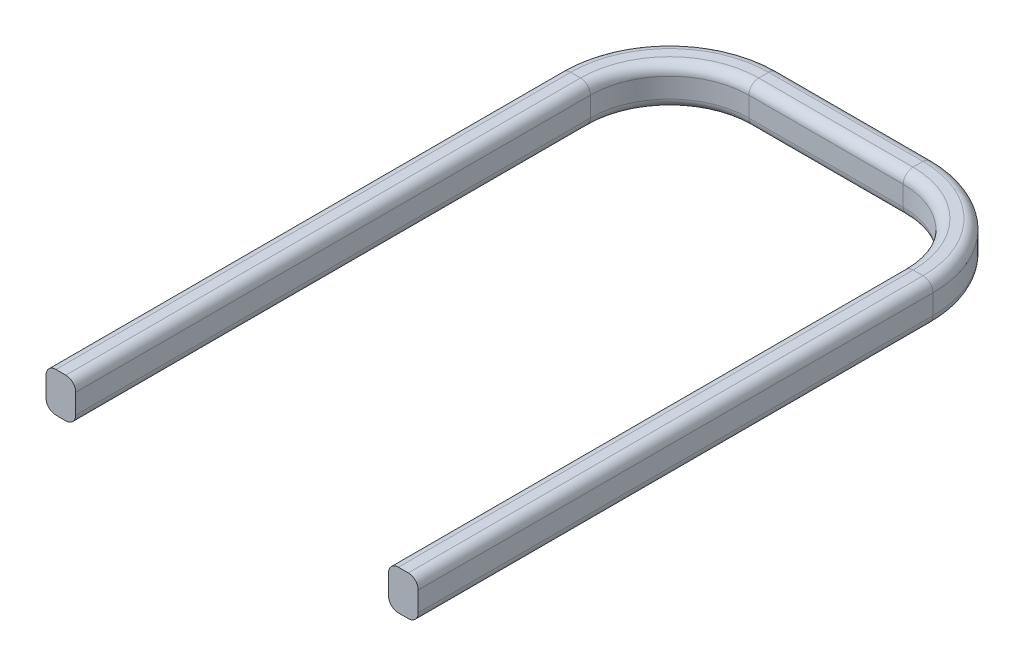
ISO-10303-21;
HEADER;
FILE_DESCRIPTION(('STEP AP214'),'2;1');
FILE_NAME('part.step','',(''),(''),'','','');
FILE_SCHEMA(('AUTOMOTIVE_DESIGN { 1 0 10303 214 1 1 1 1 }'));
ENDSEC;
DATA;
#1=APPLICATION_CONTEXT('core data for automotive mechanical design processes');
#2=APPLICATION_PROTOCOL_DEFINITION('international standard','automotive_design',2000,#1);
#3=PRODUCT_CONTEXT('',#1,'mechanical');
#4=PRODUCT('Part','Part','',(#3));
#5=PRODUCT_RELATED_PRODUCT_CATEGORY('part','',(#4));
#6=PRODUCT_DEFINITION_FORMATION('','',#4);
#7=PRODUCT_DEFINITION_CONTEXT('part definition',#1,'design');
#8=PRODUCT_DEFINITION('design','',#6,#7);
#9=PRODUCT_DEFINITION_SHAPE('','',#8);
#10=(LENGTH_UNIT() NAMED_UNIT(*) SI_UNIT(.MILLI.,.METRE.));
#11=(NAMED_UNIT(*) PLANE_ANGLE_UNIT() SI_UNIT($,.RADIAN.));
#12=(NAMED_UNIT(*) SI_UNIT($,.STERADIAN.) SOLID_ANGLE_UNIT());
#13=UNCERTAINTY_MEASURE_WITH_UNIT(LENGTH_MEASURE(1.E-05),#10,'distance_accuracy_value','');
#14=(GEOMETRIC_REPRESENTATION_CONTEXT(3) GLOBAL_UNCERTAINTY_ASSIGNED_CONTEXT((#13)) GLOBAL_UNIT_ASSIGNED_CONTEXT((#10,
#11,#12)) REPRESENTATION_CONTEXT('',''));
#15=CARTESIAN_POINT('',(0.,0.,0.));
#16=DIRECTION('',(0.,0.,1.));
#17=DIRECTION('',(1.,0.,0.));
#18=AXIS2_PLACEMENT_3D('',#15,#16,#17);
#19=CARTESIAN_POINT('',(0.,0.,0.));
#20=DIRECTION('',(0.,0.,1.));
#21=DIRECTION('',(1.,0.,0.));
#22=AXIS2_PLACEMENT_3D('',#19,#20,#21);
#23=PLANE('',#22);
#24=DIRECTION('',(0.,-1.,0.));
#25=VECTOR('',#24,1.);
#26=CARTESIAN_POINT('',(-4.7,0.,0.));
#27=LINE('',#26,#25);
#28=CARTESIAN_POINT('',(-4.7,0.75,0.));
#29=VERTEX_POINT('',#28);
#30=CARTESIAN_POINT('',(-4.7,0.25,0.));
#31=VERTEX_POINT('',#30);
#32=EDGE_CURVE('E386',#29,#31,#27,.T.);
#33=ORIENTED_EDGE('',*,*,#32,.T.);
#34=CARTESIAN_POINT('',(-4.45,0.25,0.));
#35=DIRECTION('',(0.,0.,1.));
#36=DIRECTION('',(1.,0.,0.));
#37=AXIS2_PLACEMENT_3D('',#34,#35,#36);
#38=CIRCLE('',#37,0.25);
#39=CARTESIAN_POINT('',(-4.45,0.,0.));
#40=VERTEX_POINT('',#39);
#41=EDGE_CURVE('E311',#31,#40,#38,.T.);
#42=ORIENTED_EDGE('',*,*,#41,.T.);
#43=DIRECTION('',(1.,0.,0.));
#44=VECTOR('',#43,1.);
#45=CARTESIAN_POINT('',(-3.95,0.,0.));
#46=LINE('',#45,#44);
#47=CARTESIAN_POINT('',(-4.2,0.,0.));
#48=VERTEX_POINT('',#47);
#49=EDGE_CURVE('E391',#40,#48,#46,.T.);
#50=ORIENTED_EDGE('',*,*,#49,.T.);
#51=CARTESIAN_POINT('',(-4.2,0.25,0.));
#52=DIRECTION('',(0.,0.,1.));
#53=DIRECTION('',(1.,0.,0.));
#54=AXIS2_PLACEMENT_3D('',#51,#52,#53);
#55=CIRCLE('',#54,0.25);
#56=CARTESIAN_POINT('',(-3.95,0.25,0.));
#57=VERTEX_POINT('',#56);
#58=EDGE_CURVE('E309',#48,#57,#55,.T.);
#59=ORIENTED_EDGE('',*,*,#58,.T.);
#60=DIRECTION('',(0.,1.,0.));
#61=VECTOR('',#60,1.);
#62=CARTESIAN_POINT('',(-3.95,0.,0.));
#63=LINE('',#62,#61);
#64=CARTESIAN_POINT('',(-3.95,0.75,0.));
#65=VERTEX_POINT('',#64);
#66=EDGE_CURVE('E330',#57,#65,#63,.T.);
#67=ORIENTED_EDGE('',*,*,#66,.T.);
#68=CARTESIAN_POINT('',(-4.2,0.75,0.));
#69=DIRECTION('',(0.,0.,1.));
#70=DIRECTION('',(1.,0.,0.));
#71=AXIS2_PLACEMENT_3D('',#68,#69,#70);
#72=CIRCLE('',#71,0.25);
#73=CARTESIAN_POINT('',(-4.2,1.,0.));
#74=VERTEX_POINT('',#73);
#75=EDGE_CURVE('E57',#65,#74,#72,.T.);
#76=ORIENTED_EDGE('',*,*,#75,.T.);
#77=DIRECTION('',(-1.,0.,0.));
#78=VECTOR('',#77,1.);
#79=CARTESIAN_POINT('',(-3.95,1.,0.));
#80=LINE('',#79,#78);
#81=CARTESIAN_POINT('',(-4.45,1.,0.));
#82=VERTEX_POINT('',#81);
#83=EDGE_CURVE('E384',#74,#82,#80,.T.);
#84=ORIENTED_EDGE('',*,*,#83,.T.);
#85=CARTESIAN_POINT('',(-4.45,0.75,0.));
#86=DIRECTION('',(0.,0.,1.));
#87=DIRECTION('',(1.,0.,0.));
#88=AXIS2_PLACEMENT_3D('',#85,#86,#87);
#89=CIRCLE('',#88,0.25);
#90=EDGE_CURVE('E307',#82,#29,#89,.T.);
#91=ORIENTED_EDGE('',*,*,#90,.T.);
#92=EDGE_LOOP('',(#33,#42,#50,#59,#67,#76,#84,#91));
#93=FACE_BOUND('',#92,.T.);
#94=ADVANCED_FACE('F35',(#93),#23,.T.);
#95=CARTESIAN_POINT('',(0.,0.,0.));
#96=DIRECTION('',(0.,0.,-1.));
#97=DIRECTION('',(-1.,0.,0.));
#98=AXIS2_PLACEMENT_3D('',#95,#96,#97);
#99=PLANE('',#98);
#100=DIRECTION('',(-1.,0.,0.));
#101=VECTOR('',#100,1.);
#102=CARTESIAN_POINT('',(3.95,0.,0.));
#103=LINE('',#102,#101);
#104=CARTESIAN_POINT('',(4.45,0.,0.));
#105=VERTEX_POINT('',#104);
#106=CARTESIAN_POINT('',(4.2,0.,0.));
#107=VERTEX_POINT('',#106);
#108=EDGE_CURVE('E215',#105,#107,#103,.T.);
#109=ORIENTED_EDGE('',*,*,#108,.F.);
#110=CARTESIAN_POINT('',(4.45,0.25,0.));
#111=DIRECTION('',(0.,0.,-1.));
#112=DIRECTION('',(-1.,0.,0.));
#113=AXIS2_PLACEMENT_3D('',#110,#111,#112);
#114=CIRCLE('',#113,0.25);
#115=CARTESIAN_POINT('',(4.7,0.25,0.));
#116=VERTEX_POINT('',#115);
#117=EDGE_CURVE('E198',#105,#116,#114,.F.);
#118=ORIENTED_EDGE('',*,*,#117,.T.);
#119=DIRECTION('',(0.,-1.,0.));
#120=VECTOR('',#119,1.);
#121=CARTESIAN_POINT('',(4.7,0.,0.));
#122=LINE('',#121,#120);
#123=CARTESIAN_POINT('',(4.7,0.75,0.));
#124=VERTEX_POINT('',#123);
#125=EDGE_CURVE('E225',#124,#116,#122,.T.);
#126=ORIENTED_EDGE('',*,*,#125,.F.);
#127=CARTESIAN_POINT('',(4.45,0.75,0.));
#128=DIRECTION('',(0.,0.,-1.));
#129=DIRECTION('',(-1.,0.,0.));
#130=AXIS2_PLACEMENT_3D('',#127,#128,#129);
#131=CIRCLE('',#130,0.25);
#132=CARTESIAN_POINT('',(4.45,1.,0.));
#133=VERTEX_POINT('',#132);
#134=EDGE_CURVE('E234',#124,#133,#131,.F.);
#135=ORIENTED_EDGE('',*,*,#134,.T.);
#136=DIRECTION('',(1.,0.,0.));
#137=VECTOR('',#136,1.);
#138=CARTESIAN_POINT('',(3.95,1.,0.));
#139=LINE('',#138,#137);
#140=CARTESIAN_POINT('',(4.2,1.,0.));
#141=VERTEX_POINT('',#140);
#142=EDGE_CURVE('E228',#141,#133,#139,.T.);
#143=ORIENTED_EDGE('',*,*,#142,.F.);
#144=CARTESIAN_POINT('',(4.2,0.75,0.));
#145=DIRECTION('',(0.,0.,-1.));
#146=DIRECTION('',(-1.,0.,0.));
#147=AXIS2_PLACEMENT_3D('',#144,#145,#146);
#148=CIRCLE('',#147,0.25);
#149=CARTESIAN_POINT('',(3.95,0.75,0.));
#150=VERTEX_POINT('',#149);
#151=EDGE_CURVE('E220',#141,#150,#148,.F.);
#152=ORIENTED_EDGE('',*,*,#151,.T.);
#153=DIRECTION('',(0.,1.,0.));
#154=VECTOR('',#153,1.);
#155=CARTESIAN_POINT('',(3.95,0.,0.));
#156=LINE('',#155,#154);
#157=CARTESIAN_POINT('',(3.95,0.25,0.));
#158=VERTEX_POINT('',#157);
#159=EDGE_CURVE('E407',#158,#150,#156,.T.);
#160=ORIENTED_EDGE('',*,*,#159,.F.);
#161=CARTESIAN_POINT('',(4.2,0.25,0.));
#162=DIRECTION('',(0.,0.,-1.));
#163=DIRECTION('',(-1.,0.,0.));
#164=AXIS2_PLACEMENT_3D('',#161,#162,#163);
#165=CIRCLE('',#164,0.25);
#166=EDGE_CURVE('E209',#158,#107,#165,.F.);
#167=ORIENTED_EDGE('',*,*,#166,.T.);
#168=EDGE_LOOP('',(#109,#118,#126,#135,#143,#152,#160,#167));
#169=FACE_BOUND('',#168,.T.);
#170=ADVANCED_FACE('F223',(#169),#99,.F.);
#171=CARTESIAN_POINT('',(-3.95,0.,0.));
#172=DIRECTION('',(-1.,0.,0.));
#173=DIRECTION('',(0.,0.,1.));
#174=AXIS2_PLACEMENT_3D('',#171,#172,#173);
#175=PLANE('',#174);
#176=ORIENTED_EDGE('',*,*,#66,.F.);
#177=DIRECTION('',(0.,0.,-1.));
#178=VECTOR('',#177,1.);
#179=CARTESIAN_POINT('',(-3.95,0.25,0.));
#180=LINE('',#179,#178);
#181=CARTESIAN_POINT('',(-3.95,0.25,-13.));
#182=VERTEX_POINT('',#181);
#183=EDGE_CURVE('E315',#57,#182,#180,.T.);
#184=ORIENTED_EDGE('',*,*,#183,.T.);
#185=DIRECTION('',(0.,1.,0.));
#186=VECTOR('',#185,1.);
#187=CARTESIAN_POINT('',(-3.95,0.,-13.));
#188=LINE('',#187,#186);
#189=CARTESIAN_POINT('',(-3.95,0.75,-13.));
#190=VERTEX_POINT('',#189);
#191=EDGE_CURVE('E380',#182,#190,#188,.T.);
#192=ORIENTED_EDGE('',*,*,#191,.T.);
#193=DIRECTION('',(0.,0.,-1.));
#194=VECTOR('',#193,1.);
#195=CARTESIAN_POINT('',(-3.95,0.75,0.));
#196=LINE('',#195,#194);
#197=EDGE_CURVE('E313',#190,#65,#196,.F.);
#198=ORIENTED_EDGE('',*,*,#197,.T.);
#199=EDGE_LOOP('',(#176,#184,#192,#198));
#200=FACE_BOUND('',#199,.T.);
#201=ADVANCED_FACE('F377',(#200),#175,.F.);
#202=CARTESIAN_POINT('',(-3.95,1.,0.));
#203=DIRECTION('',(0.,-1.,0.));
#204=DIRECTION('',(1.,0.,0.));
#205=AXIS2_PLACEMENT_3D('',#202,#203,#204);
#206=PLANE('',#205);
#207=DIRECTION('',(-1.,0.,0.));
#208=VECTOR('',#207,1.);
#209=CARTESIAN_POINT('',(-3.95,1.,-13.));
#210=LINE('',#209,#208);
#211=CARTESIAN_POINT('',(-4.2,1.,-13.));
#212=VERTEX_POINT('',#211);
#213=CARTESIAN_POINT('',(-4.45,1.,-13.));
#214=VERTEX_POINT('',#213);
#215=EDGE_CURVE('E390',#212,#214,#210,.T.);
#216=ORIENTED_EDGE('',*,*,#215,.T.);
#217=DIRECTION('',(0.,0.,-1.));
#218=VECTOR('',#217,1.);
#219=CARTESIAN_POINT('',(-4.45,1.,0.));
#220=LINE('',#219,#218);
#221=EDGE_CURVE('E11',#214,#82,#220,.F.);
#222=ORIENTED_EDGE('',*,*,#221,.T.);
#223=ORIENTED_EDGE('',*,*,#83,.F.);
#224=DIRECTION('',(0.,0.,-1.));
#225=VECTOR('',#224,1.);
#226=CARTESIAN_POINT('',(-4.2,1.,0.));
#227=LINE('',#226,#225);
#228=EDGE_CURVE('E44',#74,#212,#227,.T.);
#229=ORIENTED_EDGE('',*,*,#228,.T.);
#230=EDGE_LOOP('',(#216,#222,#223,#229));
#231=FACE_BOUND('',#230,.T.);
#232=ADVANCED_FACE('F788',(#231),#206,.F.);
#233=CARTESIAN_POINT('',(-4.7,0.,0.));
#234=DIRECTION('',(1.,0.,0.));
#235=DIRECTION('',(0.,0.,-1.));
#236=AXIS2_PLACEMENT_3D('',#233,#234,#235);
#237=PLANE('',#236);
#238=DIRECTION('',(0.,-1.,0.));
#239=VECTOR('',#238,1.);
#240=CARTESIAN_POINT('',(-4.7,0.,-13.));
#241=LINE('',#240,#239);
#242=CARTESIAN_POINT('',(-4.7,0.75,-13.));
#243=VERTEX_POINT('',#242);
#244=CARTESIAN_POINT('',(-4.7,0.25,-13.));
#245=VERTEX_POINT('',#244);
#246=EDGE_CURVE('E411',#243,#245,#241,.T.);
#247=ORIENTED_EDGE('',*,*,#246,.T.);
#248=DIRECTION('',(0.,0.,-1.));
#249=VECTOR('',#248,1.);
#250=CARTESIAN_POINT('',(-4.7,0.25,0.));
#251=LINE('',#250,#249);
#252=EDGE_CURVE('E304',#245,#31,#251,.F.);
#253=ORIENTED_EDGE('',*,*,#252,.T.);
#254=ORIENTED_EDGE('',*,*,#32,.F.);
#255=DIRECTION('',(0.,0.,-1.));
#256=VECTOR('',#255,1.);
#257=CARTESIAN_POINT('',(-4.7,0.75,0.));
#258=LINE('',#257,#256);
#259=EDGE_CURVE('E302',#29,#243,#258,.T.);
#260=ORIENTED_EDGE('',*,*,#259,.T.);
#261=EDGE_LOOP('',(#247,#253,#254,#260));
#262=FACE_BOUND('',#261,.T.);
#263=ADVANCED_FACE('F778',(#262),#237,.F.);
#264=CARTESIAN_POINT('',(-3.95,0.,0.));
#265=DIRECTION('',(0.,1.,0.));
#266=DIRECTION('',(-1.,0.,0.));
#267=AXIS2_PLACEMENT_3D('',#264,#265,#266);
#268=PLANE('',#267);
#269=ORIENTED_EDGE('',*,*,#49,.F.);
#270=DIRECTION('',(0.,0.,-1.));
#271=VECTOR('',#270,1.);
#272=CARTESIAN_POINT('',(-4.45,0.,0.));
#273=LINE('',#272,#271);
#274=CARTESIAN_POINT('',(-4.45,0.,-13.));
#275=VERTEX_POINT('',#274);
#276=EDGE_CURVE('E300',#40,#275,#273,.T.);
#277=ORIENTED_EDGE('',*,*,#276,.T.);
#278=DIRECTION('',(1.,0.,0.));
#279=VECTOR('',#278,1.);
#280=CARTESIAN_POINT('',(-3.95,0.,-13.));
#281=LINE('',#280,#279);
#282=CARTESIAN_POINT('',(-4.2,0.,-13.));
#283=VERTEX_POINT('',#282);
#284=EDGE_CURVE('E396',#275,#283,#281,.T.);
#285=ORIENTED_EDGE('',*,*,#284,.T.);
#286=DIRECTION('',(0.,0.,-1.));
#287=VECTOR('',#286,1.);
#288=CARTESIAN_POINT('',(-4.2,0.,0.));
#289=LINE('',#288,#287);
#290=EDGE_CURVE('E298',#283,#48,#289,.F.);
#291=ORIENTED_EDGE('',*,*,#290,.T.);
#292=EDGE_LOOP('',(#269,#277,#285,#291));
#293=FACE_BOUND('',#292,.T.);
#294=ADVANCED_FACE('F768',(#293),#268,.F.);
#295=CARTESIAN_POINT('',(-1.95,0.,-13.));
#296=DIRECTION('',(0.,-1.,0.));
#297=DIRECTION('',(0.,0.,-1.));
#298=AXIS2_PLACEMENT_3D('',#295,#296,#297);
#299=CYLINDRICAL_SURFACE('',#298,2.);
#300=ORIENTED_EDGE('',*,*,#191,.F.);
#301=CARTESIAN_POINT('',(-1.95,0.25,-13.));
#302=DIRECTION('',(0.,1.,0.));
#303=DIRECTION('',(0.,0.,1.));
#304=AXIS2_PLACEMENT_3D('',#301,#302,#303);
#305=CIRCLE('',#304,2.);
#306=CARTESIAN_POINT('',(-1.95,0.25,-15.));
#307=VERTEX_POINT('',#306);
#308=EDGE_CURVE('E279',#182,#307,#305,.F.);
#309=ORIENTED_EDGE('',*,*,#308,.T.);
#310=DIRECTION('',(0.,1.,0.));
#311=VECTOR('',#310,1.);
#312=CARTESIAN_POINT('',(-1.95,0.,-15.));
#313=LINE('',#312,#311);
#314=CARTESIAN_POINT('',(-1.95,0.75,-15.));
#315=VERTEX_POINT('',#314);
#316=EDGE_CURVE('E392',#307,#315,#313,.T.);
#317=ORIENTED_EDGE('',*,*,#316,.T.);
#318=CARTESIAN_POINT('',(-1.95,0.75,-13.));
#319=DIRECTION('',(0.,-1.,0.));
#320=DIRECTION('',(0.,0.,-1.));
#321=AXIS2_PLACEMENT_3D('',#318,#319,#320);
#322=CIRCLE('',#321,2.);
#323=EDGE_CURVE('E277',#315,#190,#322,.F.);
#324=ORIENTED_EDGE('',*,*,#323,.T.);
#325=EDGE_LOOP('',(#300,#309,#317,#324));
#326=FACE_BOUND('',#325,.T.);
#327=ADVANCED_FACE('F758',(#326),#299,.F.);
#328=CARTESIAN_POINT('',(-3.95,1.,-13.));
#329=DIRECTION('',(0.,-1.,0.));
#330=DIRECTION('',(0.,0.,-1.));
#331=AXIS2_PLACEMENT_3D('',#328,#329,#330);
#332=PLANE('',#331);
#333=DIRECTION('',(0.,0.,-1.));
#334=VECTOR('',#333,1.);
#335=CARTESIAN_POINT('',(-1.95,1.,-15.));
#336=LINE('',#335,#334);
#337=CARTESIAN_POINT('',(-1.95,1.,-15.25));
#338=VERTEX_POINT('',#337);
#339=CARTESIAN_POINT('',(-1.95,1.,-15.5));
#340=VERTEX_POINT('',#339);
#341=EDGE_CURVE('E395',#338,#340,#336,.T.);
#342=ORIENTED_EDGE('',*,*,#341,.T.);
#343=CARTESIAN_POINT('',(-1.95,1.,-13.));
#344=DIRECTION('',(0.,-1.,0.));
#345=DIRECTION('',(0.,0.,-1.));
#346=AXIS2_PLACEMENT_3D('',#343,#344,#345);
#347=CIRCLE('',#346,2.5);
#348=EDGE_CURVE('E296',#340,#214,#347,.F.);
#349=ORIENTED_EDGE('',*,*,#348,.T.);
#350=ORIENTED_EDGE('',*,*,#215,.F.);
#351=CARTESIAN_POINT('',(-1.95,1.,-13.));
#352=DIRECTION('',(0.,-1.,0.));
#353=DIRECTION('',(0.,0.,-1.));
#354=AXIS2_PLACEMENT_3D('',#351,#352,#353);
#355=CIRCLE('',#354,2.25);
#356=EDGE_CURVE('E294',#212,#338,#355,.T.);
#357=ORIENTED_EDGE('',*,*,#356,.T.);
#358=EDGE_LOOP('',(#342,#349,#350,#357));
#359=FACE_BOUND('',#358,.T.);
#360=ADVANCED_FACE('F748',(#359),#332,.F.);
#361=CARTESIAN_POINT('',(-1.95,0.,-13.));
#362=DIRECTION('',(0.,-1.,0.));
#363=DIRECTION('',(0.,0.,-1.));
#364=AXIS2_PLACEMENT_3D('',#361,#362,#363);
#365=CYLINDRICAL_SURFACE('',#364,2.75);
#366=DIRECTION('',(0.,-1.,0.));
#367=VECTOR('',#366,1.);
#368=CARTESIAN_POINT('',(-1.95,0.,-15.75));
#369=LINE('',#368,#367);
#370=CARTESIAN_POINT('',(-1.95,0.75,-15.75));
#371=VERTEX_POINT('',#370);
#372=CARTESIAN_POINT('',(-1.95,0.25,-15.75));
#373=VERTEX_POINT('',#372);
#374=EDGE_CURVE('E414',#371,#373,#369,.T.);
#375=ORIENTED_EDGE('',*,*,#374,.T.);
#376=CARTESIAN_POINT('',(-1.95,0.25,-13.));
#377=DIRECTION('',(0.,1.,0.));
#378=DIRECTION('',(0.,0.,1.));
#379=AXIS2_PLACEMENT_3D('',#376,#377,#378);
#380=CIRCLE('',#379,2.75);
#381=EDGE_CURVE('E262',#373,#245,#380,.T.);
#382=ORIENTED_EDGE('',*,*,#381,.T.);
#383=ORIENTED_EDGE('',*,*,#246,.F.);
#384=CARTESIAN_POINT('',(-1.95,0.75,-13.));
#385=DIRECTION('',(0.,-1.,0.));
#386=DIRECTION('',(0.,0.,-1.));
#387=AXIS2_PLACEMENT_3D('',#384,#385,#386);
#388=CIRCLE('',#387,2.75);
#389=EDGE_CURVE('E260',#243,#371,#388,.T.);
#390=ORIENTED_EDGE('',*,*,#389,.T.);
#391=EDGE_LOOP('',(#375,#382,#383,#390));
#392=FACE_BOUND('',#391,.T.);
#393=ADVANCED_FACE('F738',(#392),#365,.T.);
#394=CARTESIAN_POINT('',(-3.95,0.,-13.));
#395=DIRECTION('',(0.,1.,0.));
#396=DIRECTION('',(0.,0.,1.));
#397=AXIS2_PLACEMENT_3D('',#394,#395,#396);
#398=PLANE('',#397);
#399=ORIENTED_EDGE('',*,*,#284,.F.);
#400=CARTESIAN_POINT('',(-1.95,0.,-13.));
#401=DIRECTION('',(0.,1.,0.));
#402=DIRECTION('',(0.,0.,1.));
#403=AXIS2_PLACEMENT_3D('',#400,#401,#402);
#404=CIRCLE('',#403,2.5);
#405=CARTESIAN_POINT('',(-1.95,0.,-15.5));
#406=VERTEX_POINT('',#405);
#407=EDGE_CURVE('E258',#275,#406,#404,.F.);
#408=ORIENTED_EDGE('',*,*,#407,.T.);
#409=DIRECTION('',(0.,0.,1.));
#410=VECTOR('',#409,1.);
#411=CARTESIAN_POINT('',(-1.95,0.,-15.));
#412=LINE('',#411,#410);
#413=CARTESIAN_POINT('',(-1.95,0.,-15.25));
#414=VERTEX_POINT('',#413);
#415=EDGE_CURVE('E401',#406,#414,#412,.T.);
#416=ORIENTED_EDGE('',*,*,#415,.T.);
#417=CARTESIAN_POINT('',(-1.95,0.,-13.));
#418=DIRECTION('',(0.,1.,0.));
#419=DIRECTION('',(0.,0.,1.));
#420=AXIS2_PLACEMENT_3D('',#417,#418,#419);
#421=CIRCLE('',#420,2.25);
#422=EDGE_CURVE('E256',#414,#283,#421,.T.);
#423=ORIENTED_EDGE('',*,*,#422,.T.);
#424=EDGE_LOOP('',(#399,#408,#416,#423));
#425=FACE_BOUND('',#424,.T.);
#426=ADVANCED_FACE('F729',(#425),#398,.F.);
#427=CARTESIAN_POINT('',(-1.95,0.,-15.));
#428=DIRECTION('',(0.,0.,-1.));
#429=DIRECTION('',(-1.,0.,0.));
#430=AXIS2_PLACEMENT_3D('',#427,#428,#429);
#431=PLANE('',#430);
#432=ORIENTED_EDGE('',*,*,#316,.F.);
#433=DIRECTION('',(1.,0.,0.));
#434=VECTOR('',#433,1.);
#435=CARTESIAN_POINT('',(-1.95,0.25,-15.));
#436=LINE('',#435,#434);
#437=CARTESIAN_POINT('',(1.94999999999999,0.25,-15.));
#438=VERTEX_POINT('',#437);
#439=EDGE_CURVE('E275',#307,#438,#436,.T.);
#440=ORIENTED_EDGE('',*,*,#439,.T.);
#441=DIRECTION('',(0.,1.,0.));
#442=VECTOR('',#441,1.);
#443=CARTESIAN_POINT('',(1.94999999999999,0.,-15.));
#444=LINE('',#443,#442);
#445=CARTESIAN_POINT('',(1.94999999999999,0.75,-15.));
#446=VERTEX_POINT('',#445);
#447=EDGE_CURVE('E397',#438,#446,#444,.T.);
#448=ORIENTED_EDGE('',*,*,#447,.T.);
#449=DIRECTION('',(1.,0.,0.));
#450=VECTOR('',#449,1.);
#451=CARTESIAN_POINT('',(-1.95,0.75,-15.));
#452=LINE('',#451,#450);
#453=EDGE_CURVE('E273',#446,#315,#452,.F.);
#454=ORIENTED_EDGE('',*,*,#453,.T.);
#455=EDGE_LOOP('',(#432,#440,#448,#454));
#456=FACE_BOUND('',#455,.T.);
#457=ADVANCED_FACE('F474',(#456),#431,.F.);
#458=CARTESIAN_POINT('',(-1.95,1.,-15.));
#459=DIRECTION('',(0.,-1.,0.));
#460=DIRECTION('',(0.,0.,-1.));
#461=AXIS2_PLACEMENT_3D('',#458,#459,#460);
#462=PLANE('',#461);
#463=DIRECTION('',(0.,0.,-1.));
#464=VECTOR('',#463,1.);
#465=CARTESIAN_POINT('',(1.94999999999999,1.,-15.));
#466=LINE('',#465,#464);
#467=CARTESIAN_POINT('',(1.94999999999999,1.,-15.25));
#468=VERTEX_POINT('',#467);
#469=CARTESIAN_POINT('',(1.94999999999999,1.,-15.5));
#470=VERTEX_POINT('',#469);
#471=EDGE_CURVE('E400',#468,#470,#466,.T.);
#472=ORIENTED_EDGE('',*,*,#471,.T.);
#473=DIRECTION('',(1.,0.,0.));
#474=VECTOR('',#473,1.);
#475=CARTESIAN_POINT('',(-1.95,1.,-15.5));
#476=LINE('',#475,#474);
#477=EDGE_CURVE('E292',#470,#340,#476,.F.);
#478=ORIENTED_EDGE('',*,*,#477,.T.);
#479=ORIENTED_EDGE('',*,*,#341,.F.);
#480=DIRECTION('',(1.,0.,0.));
#481=VECTOR('',#480,1.);
#482=CARTESIAN_POINT('',(-1.95,1.,-15.25));
#483=LINE('',#482,#481);
#484=EDGE_CURVE('E290',#338,#468,#483,.T.);
#485=ORIENTED_EDGE('',*,*,#484,.T.);
#486=EDGE_LOOP('',(#472,#478,#479,#485));
#487=FACE_BOUND('',#486,.T.);
#488=ADVANCED_FACE('F479',(#487),#462,.F.);
#489=CARTESIAN_POINT('',(-1.95,0.,-15.75));
#490=DIRECTION('',(0.,0.,1.));
#491=DIRECTION('',(1.,0.,0.));
#492=AXIS2_PLACEMENT_3D('',#489,#490,#491);
#493=PLANE('',#492);
#494=DIRECTION('',(0.,-1.,0.));
#495=VECTOR('',#494,1.);
#496=CARTESIAN_POINT('',(1.94999999999999,0.,-15.75));
#497=LINE('',#496,#495);
#498=CARTESIAN_POINT('',(1.94999999999999,0.75,-15.75));
#499=VERTEX_POINT('',#498);
#500=CARTESIAN_POINT('',(1.94999999999999,0.25,-15.75));
#501=VERTEX_POINT('',#500);
#502=EDGE_CURVE('E417',#499,#501,#497,.T.);
#503=ORIENTED_EDGE('',*,*,#502,.T.);
#504=DIRECTION('',(1.,0.,0.));
#505=VECTOR('',#504,1.);
#506=CARTESIAN_POINT('',(-1.95,0.25,-15.75));
#507=LINE('',#506,#505);
#508=EDGE_CURVE('E254',#501,#373,#507,.F.);
#509=ORIENTED_EDGE('',*,*,#508,.T.);
#510=ORIENTED_EDGE('',*,*,#374,.F.);
#511=DIRECTION('',(1.,0.,0.));
#512=VECTOR('',#511,1.);
#513=CARTESIAN_POINT('',(-1.95,0.75,-15.75));
#514=LINE('',#513,#512);
#515=EDGE_CURVE('E252',#371,#499,#514,.T.);
#516=ORIENTED_EDGE('',*,*,#515,.T.);
#517=EDGE_LOOP('',(#503,#509,#510,#516));
#518=FACE_BOUND('',#517,.T.);
#519=ADVANCED_FACE('F704',(#518),#493,.F.);
#520=CARTESIAN_POINT('',(-1.95,0.,-15.));
#521=DIRECTION('',(0.,1.,0.));
#522=DIRECTION('',(0.,0.,1.));
#523=AXIS2_PLACEMENT_3D('',#520,#521,#522);
#524=PLANE('',#523);
#525=ORIENTED_EDGE('',*,*,#415,.F.);
#526=DIRECTION('',(1.,0.,0.));
#527=VECTOR('',#526,1.);
#528=CARTESIAN_POINT('',(-1.95,0.,-15.5));
#529=LINE('',#528,#527);
#530=CARTESIAN_POINT('',(1.94999999999999,0.,-15.5));
#531=VERTEX_POINT('',#530);
#532=EDGE_CURVE('E250',#406,#531,#529,.T.);
#533=ORIENTED_EDGE('',*,*,#532,.T.);
#534=DIRECTION('',(0.,0.,1.));
#535=VECTOR('',#534,1.);
#536=CARTESIAN_POINT('',(1.94999999999999,0.,-15.));
#537=LINE('',#536,#535);
#538=CARTESIAN_POINT('',(1.94999999999999,0.,-15.25));
#539=VERTEX_POINT('',#538);
#540=EDGE_CURVE('E406',#531,#539,#537,.T.);
#541=ORIENTED_EDGE('',*,*,#540,.T.);
#542=DIRECTION('',(1.,0.,0.));
#543=VECTOR('',#542,1.);
#544=CARTESIAN_POINT('',(-1.95,0.,-15.25));
#545=LINE('',#544,#543);
#546=EDGE_CURVE('E248',#539,#414,#545,.F.);
#547=ORIENTED_EDGE('',*,*,#546,.T.);
#548=EDGE_LOOP('',(#525,#533,#541,#547));
#549=FACE_BOUND('',#548,.T.);
#550=ADVANCED_FACE('F441',(#549),#524,.F.);
#551=CARTESIAN_POINT('',(1.95,0.,-13.));
#552=DIRECTION('',(0.,-1.,0.));
#553=DIRECTION('',(0.,0.,-1.));
#554=AXIS2_PLACEMENT_3D('',#551,#552,#553);
#555=CYLINDRICAL_SURFACE('',#554,2.);
#556=ORIENTED_EDGE('',*,*,#447,.F.);
#557=CARTESIAN_POINT('',(1.95,0.25,-13.));
#558=DIRECTION('',(0.,1.,0.));
#559=DIRECTION('',(0.,0.,1.));
#560=AXIS2_PLACEMENT_3D('',#557,#558,#559);
#561=CIRCLE('',#560,2.);
#562=CARTESIAN_POINT('',(3.95,0.25,-13.));
#563=VERTEX_POINT('',#562);
#564=EDGE_CURVE('E271',#438,#563,#561,.F.);
#565=ORIENTED_EDGE('',*,*,#564,.T.);
#566=DIRECTION('',(0.,1.,0.));
#567=VECTOR('',#566,1.);
#568=CARTESIAN_POINT('',(3.95,0.,-13.));
#569=LINE('',#568,#567);
#570=CARTESIAN_POINT('',(3.95,0.75,-13.));
#571=VERTEX_POINT('',#570);
#572=EDGE_CURVE('E402',#563,#571,#569,.T.);
#573=ORIENTED_EDGE('',*,*,#572,.T.);
#574=CARTESIAN_POINT('',(1.95,0.75,-13.));
#575=DIRECTION('',(0.,-1.,0.));
#576=DIRECTION('',(0.,0.,-1.));
#577=AXIS2_PLACEMENT_3D('',#574,#575,#576);
#578=CIRCLE('',#577,2.);
#579=EDGE_CURVE('E269',#571,#446,#578,.F.);
#580=ORIENTED_EDGE('',*,*,#579,.T.);
#581=EDGE_LOOP('',(#556,#565,#573,#580));
#582=FACE_BOUND('',#581,.T.);
#583=ADVANCED_FACE('F459',(#582),#555,.F.);
#584=CARTESIAN_POINT('',(1.94999999999999,1.,-15.));
#585=DIRECTION('',(0.,-1.,0.));
#586=DIRECTION('',(0.,0.,-1.));
#587=AXIS2_PLACEMENT_3D('',#584,#585,#586);
#588=PLANE('',#587);
#589=DIRECTION('',(1.,0.,0.));
#590=VECTOR('',#589,1.);
#591=CARTESIAN_POINT('',(3.95,1.,-13.));
#592=LINE('',#591,#590);
#593=CARTESIAN_POINT('',(4.2,1.,-13.));
#594=VERTEX_POINT('',#593);
#595=CARTESIAN_POINT('',(4.45,1.,-13.));
#596=VERTEX_POINT('',#595);
#597=EDGE_CURVE('E405',#594,#596,#592,.T.);
#598=ORIENTED_EDGE('',*,*,#597,.T.);
#599=CARTESIAN_POINT('',(1.95,1.,-13.));
#600=DIRECTION('',(0.,-1.,0.));
#601=DIRECTION('',(0.,0.,-1.));
#602=AXIS2_PLACEMENT_3D('',#599,#600,#601);
#603=CIRCLE('',#602,2.5);
#604=EDGE_CURVE('E288',#596,#470,#603,.F.);
#605=ORIENTED_EDGE('',*,*,#604,.T.);
#606=ORIENTED_EDGE('',*,*,#471,.F.);
#607=CARTESIAN_POINT('',(1.95,1.,-13.));
#608=DIRECTION('',(0.,-1.,0.));
#609=DIRECTION('',(0.,0.,-1.));
#610=AXIS2_PLACEMENT_3D('',#607,#608,#609);
#611=CIRCLE('',#610,2.25);
#612=EDGE_CURVE('E286',#468,#594,#611,.T.);
#613=ORIENTED_EDGE('',*,*,#612,.T.);
#614=EDGE_LOOP('',(#598,#605,#606,#613));
#615=FACE_BOUND('',#614,.T.);
#616=ADVANCED_FACE('F482',(#615),#588,.F.);
#617=CARTESIAN_POINT('',(1.95,0.,-13.));
#618=DIRECTION('',(0.,-1.,0.));
#619=DIRECTION('',(0.,0.,-1.));
#620=AXIS2_PLACEMENT_3D('',#617,#618,#619);
#621=CYLINDRICAL_SURFACE('',#620,2.75);
#622=DIRECTION('',(0.,-1.,0.));
#623=VECTOR('',#622,1.);
#624=CARTESIAN_POINT('',(4.7,0.,-13.));
#625=LINE('',#624,#623);
#626=CARTESIAN_POINT('',(4.7,0.75,-13.));
#627=VERTEX_POINT('',#626);
#628=CARTESIAN_POINT('',(4.7,0.25,-13.));
#629=VERTEX_POINT('',#628);
#630=EDGE_CURVE('E420',#627,#629,#625,.T.);
#631=ORIENTED_EDGE('',*,*,#630,.T.);
#632=CARTESIAN_POINT('',(1.95,0.25,-13.));
#633=DIRECTION('',(0.,1.,0.));
#634=DIRECTION('',(0.,0.,1.));
#635=AXIS2_PLACEMENT_3D('',#632,#633,#634);
#636=CIRCLE('',#635,2.75);
#637=EDGE_CURVE('E246',#629,#501,#636,.T.);
#638=ORIENTED_EDGE('',*,*,#637,.T.);
#639=ORIENTED_EDGE('',*,*,#502,.F.);
#640=CARTESIAN_POINT('',(1.95,0.75,-13.));
#641=DIRECTION('',(0.,-1.,0.));
#642=DIRECTION('',(0.,0.,-1.));
#643=AXIS2_PLACEMENT_3D('',#640,#641,#642);
#644=CIRCLE('',#643,2.75);
#645=EDGE_CURVE('E244',#499,#627,#644,.T.);
#646=ORIENTED_EDGE('',*,*,#645,.T.);
#647=EDGE_LOOP('',(#631,#638,#639,#646));
#648=FACE_BOUND('',#647,.T.);
#649=ADVANCED_FACE('F672',(#648),#621,.T.);
#650=CARTESIAN_POINT('',(1.94999999999999,0.,-15.));
#651=DIRECTION('',(0.,1.,0.));
#652=DIRECTION('',(0.,0.,1.));
#653=AXIS2_PLACEMENT_3D('',#650,#651,#652);
#654=PLANE('',#653);
#655=ORIENTED_EDGE('',*,*,#540,.F.);
#656=CARTESIAN_POINT('',(1.95,0.,-13.));
#657=DIRECTION('',(0.,1.,0.));
#658=DIRECTION('',(0.,0.,1.));
#659=AXIS2_PLACEMENT_3D('',#656,#657,#658);
#660=CIRCLE('',#659,2.5);
#661=CARTESIAN_POINT('',(4.45,0.,-13.));
#662=VERTEX_POINT('',#661);
#663=EDGE_CURVE('E242',#531,#662,#660,.F.);
#664=ORIENTED_EDGE('',*,*,#663,.T.);
#665=DIRECTION('',(-1.,0.,0.));
#666=VECTOR('',#665,1.);
#667=CARTESIAN_POINT('',(3.95,0.,-13.));
#668=LINE('',#667,#666);
#669=CARTESIAN_POINT('',(4.2,0.,-13.));
#670=VERTEX_POINT('',#669);
#671=EDGE_CURVE('E218',#662,#670,#668,.T.);
#672=ORIENTED_EDGE('',*,*,#671,.T.);
#673=CARTESIAN_POINT('',(1.95,0.,-13.));
#674=DIRECTION('',(0.,1.,0.));
#675=DIRECTION('',(0.,0.,1.));
#676=AXIS2_PLACEMENT_3D('',#673,#674,#675);
#677=CIRCLE('',#676,2.25);
#678=EDGE_CURVE('E240',#670,#539,#677,.T.);
#679=ORIENTED_EDGE('',*,*,#678,.T.);
#680=EDGE_LOOP('',(#655,#664,#672,#679));
#681=FACE_BOUND('',#680,.T.);
#682=ADVANCED_FACE('F507',(#681),#654,.F.);
#683=CARTESIAN_POINT('',(3.95,0.,-13.));
#684=DIRECTION('',(1.,0.,0.));
#685=DIRECTION('',(0.,0.,-1.));
#686=AXIS2_PLACEMENT_3D('',#683,#684,#685);
#687=PLANE('',#686);
#688=ORIENTED_EDGE('',*,*,#572,.F.);
#689=DIRECTION('',(0.,0.,1.));
#690=VECTOR('',#689,1.);
#691=CARTESIAN_POINT('',(3.95,0.25,-13.));
#692=LINE('',#691,#690);
#693=EDGE_CURVE('E266',#563,#158,#692,.T.);
#694=ORIENTED_EDGE('',*,*,#693,.T.);
#695=ORIENTED_EDGE('',*,*,#159,.T.);
#696=DIRECTION('',(0.,0.,1.));
#697=VECTOR('',#696,1.);
#698=CARTESIAN_POINT('',(3.95,0.75,-13.));
#699=LINE('',#698,#697);
#700=EDGE_CURVE('E264',#150,#571,#699,.F.);
#701=ORIENTED_EDGE('',*,*,#700,.T.);
#702=EDGE_LOOP('',(#688,#694,#695,#701));
#703=FACE_BOUND('',#702,.T.);
#704=ADVANCED_FACE('F462',(#703),#687,.F.);
#705=CARTESIAN_POINT('',(3.95,1.,-13.));
#706=DIRECTION('',(0.,-1.,0.));
#707=DIRECTION('',(1.,0.,0.));
#708=AXIS2_PLACEMENT_3D('',#705,#706,#707);
#709=PLANE('',#708);
#710=ORIENTED_EDGE('',*,*,#142,.T.);
#711=DIRECTION('',(0.,0.,1.));
#712=VECTOR('',#711,1.);
#713=CARTESIAN_POINT('',(4.45,1.,-13.));
#714=LINE('',#713,#712);
#715=EDGE_CURVE('E284',#133,#596,#714,.F.);
#716=ORIENTED_EDGE('',*,*,#715,.T.);
#717=ORIENTED_EDGE('',*,*,#597,.F.);
#718=DIRECTION('',(0.,0.,1.));
#719=VECTOR('',#718,1.);
#720=CARTESIAN_POINT('',(4.2,1.,-13.));
#721=LINE('',#720,#719);
#722=EDGE_CURVE('E281',#594,#141,#721,.T.);
#723=ORIENTED_EDGE('',*,*,#722,.T.);
#724=EDGE_LOOP('',(#710,#716,#717,#723));
#725=FACE_BOUND('',#724,.T.);
#726=ADVANCED_FACE('F499',(#725),#709,.F.);
#727=CARTESIAN_POINT('',(4.7,0.,-13.));
#728=DIRECTION('',(-1.,0.,0.));
#729=DIRECTION('',(0.,0.,1.));
#730=AXIS2_PLACEMENT_3D('',#727,#728,#729);
#731=PLANE('',#730);
#732=ORIENTED_EDGE('',*,*,#125,.T.);
#733=DIRECTION('',(0.,0.,1.));
#734=VECTOR('',#733,1.);
#735=CARTESIAN_POINT('',(4.7,0.25,-13.));
#736=LINE('',#735,#734);
#737=EDGE_CURVE('E203',#116,#629,#736,.F.);
#738=ORIENTED_EDGE('',*,*,#737,.T.);
#739=ORIENTED_EDGE('',*,*,#630,.F.);
#740=DIRECTION('',(0.,0.,1.));
#741=VECTOR('',#740,1.);
#742=CARTESIAN_POINT('',(4.7,0.75,-13.));
#743=LINE('',#742,#741);
#744=EDGE_CURVE('E208',#627,#124,#743,.T.);
#745=ORIENTED_EDGE('',*,*,#744,.T.);
#746=EDGE_LOOP('',(#732,#738,#739,#745));
#747=FACE_BOUND('',#746,.T.);
#748=ADVANCED_FACE('F496',(#747),#731,.F.);
#749=CARTESIAN_POINT('',(3.95,0.,-13.));
#750=DIRECTION('',(0.,1.,0.));
#751=DIRECTION('',(-1.,0.,0.));
#752=AXIS2_PLACEMENT_3D('',#749,#750,#751);
#753=PLANE('',#752);
#754=ORIENTED_EDGE('',*,*,#671,.F.);
#755=DIRECTION('',(0.,0.,1.));
#756=VECTOR('',#755,1.);
#757=CARTESIAN_POINT('',(4.45,0.,-13.));
#758=LINE('',#757,#756);
#759=EDGE_CURVE('E202',#662,#105,#758,.T.);
#760=ORIENTED_EDGE('',*,*,#759,.T.);
#761=ORIENTED_EDGE('',*,*,#108,.T.);
#762=DIRECTION('',(0.,0.,1.));
#763=VECTOR('',#762,1.);
#764=CARTESIAN_POINT('',(4.2,0.,-13.));
#765=LINE('',#764,#763);
#766=EDGE_CURVE('E221',#107,#670,#765,.F.);
#767=ORIENTED_EDGE('',*,*,#766,.T.);
#768=EDGE_LOOP('',(#754,#760,#761,#767));
#769=FACE_BOUND('',#768,.T.);
#770=ADVANCED_FACE('F214',(#769),#753,.F.);
#771=CARTESIAN_POINT('',(-4.45,0.25,0.));
#772=DIRECTION('',(0.,0.,-1.));
#773=DIRECTION('',(-1.,0.,0.));
#774=AXIS2_PLACEMENT_3D('',#771,#772,#773);
#775=CYLINDRICAL_SURFACE('',#774,0.25);
#776=ORIENTED_EDGE('',*,*,#41,.F.);
#777=ORIENTED_EDGE('',*,*,#252,.F.);
#778=CARTESIAN_POINT('',(-4.45,0.25,-13.));
#779=DIRECTION('',(0.,0.,-1.));
#780=DIRECTION('',(-1.,0.,0.));
#781=AXIS2_PLACEMENT_3D('',#778,#779,#780);
#782=CIRCLE('',#781,0.25);
#783=EDGE_CURVE('E327',#275,#245,#782,.T.);
#784=ORIENTED_EDGE('',*,*,#783,.F.);
#785=ORIENTED_EDGE('',*,*,#276,.F.);
#786=EDGE_LOOP('',(#776,#777,#784,#785));
#787=FACE_BOUND('',#786,.T.);
#788=ADVANCED_FACE('F512',(#787),#775,.T.);
#789=CARTESIAN_POINT('',(-1.95,0.25,-13.));
#790=DIRECTION('',(0.,1.,0.));
#791=DIRECTION('',(0.,0.,1.));
#792=AXIS2_PLACEMENT_3D('',#789,#790,#791);
#793=TOROIDAL_SURFACE('',#792,2.5,0.25);
#794=ORIENTED_EDGE('',*,*,#783,.T.);
#795=ORIENTED_EDGE('',*,*,#381,.F.);
#796=CARTESIAN_POINT('',(-1.95,0.25,-15.5));
#797=DIRECTION('',(1.,0.,0.));
#798=DIRECTION('',(0.,0.,-1.));
#799=AXIS2_PLACEMENT_3D('',#796,#797,#798);
#800=CIRCLE('',#799,0.25);
#801=EDGE_CURVE('E324',#406,#373,#800,.T.);
#802=ORIENTED_EDGE('',*,*,#801,.F.);
#803=ORIENTED_EDGE('',*,*,#407,.F.);
#804=EDGE_LOOP('',(#794,#795,#802,#803));
#805=FACE_BOUND('',#804,.T.);
#806=ADVANCED_FACE('F517',(#805),#793,.T.);
#807=CARTESIAN_POINT('',(-1.95,0.25,-15.5));
#808=DIRECTION('',(1.,0.,0.));
#809=DIRECTION('',(0.,0.,-1.));
#810=AXIS2_PLACEMENT_3D('',#807,#808,#809);
#811=CYLINDRICAL_SURFACE('',#810,0.25);
#812=ORIENTED_EDGE('',*,*,#801,.T.);
#813=ORIENTED_EDGE('',*,*,#508,.F.);
#814=CARTESIAN_POINT('',(1.94999999999999,0.25,-15.5));
#815=DIRECTION('',(1.,0.,0.));
#816=DIRECTION('',(0.,0.,-1.));
#817=AXIS2_PLACEMENT_3D('',#814,#815,#816);
#818=CIRCLE('',#817,0.25);
#819=EDGE_CURVE('E320',#531,#501,#818,.T.);
#820=ORIENTED_EDGE('',*,*,#819,.F.);
#821=ORIENTED_EDGE('',*,*,#532,.F.);
#822=EDGE_LOOP('',(#812,#813,#820,#821));
#823=FACE_BOUND('',#822,.T.);
#824=ADVANCED_FACE('F533',(#823),#811,.T.);
#825=CARTESIAN_POINT('',(1.95,0.25,-13.));
#826=DIRECTION('',(0.,1.,0.));
#827=DIRECTION('',(0.,0.,1.));
#828=AXIS2_PLACEMENT_3D('',#825,#826,#827);
#829=TOROIDAL_SURFACE('',#828,2.5,0.25);
#830=ORIENTED_EDGE('',*,*,#819,.T.);
#831=ORIENTED_EDGE('',*,*,#637,.F.);
#832=CARTESIAN_POINT('',(4.45,0.25,-13.));
#833=DIRECTION('',(0.,0.,1.));
#834=DIRECTION('',(1.,0.,0.));
#835=AXIS2_PLACEMENT_3D('',#832,#833,#834);
#836=CIRCLE('',#835,0.25);
#837=EDGE_CURVE('E318',#662,#629,#836,.T.);
#838=ORIENTED_EDGE('',*,*,#837,.F.);
#839=ORIENTED_EDGE('',*,*,#663,.F.);
#840=EDGE_LOOP('',(#830,#831,#838,#839));
#841=FACE_BOUND('',#840,.T.);
#842=ADVANCED_FACE('F530',(#841),#829,.T.);
#843=CARTESIAN_POINT('',(4.45,0.25,-13.));
#844=DIRECTION('',(0.,0.,1.));
#845=DIRECTION('',(1.,0.,0.));
#846=AXIS2_PLACEMENT_3D('',#843,#844,#845);
#847=CYLINDRICAL_SURFACE('',#846,0.25);
#848=ORIENTED_EDGE('',*,*,#837,.T.);
#849=ORIENTED_EDGE('',*,*,#737,.F.);
#850=ORIENTED_EDGE('',*,*,#117,.F.);
#851=ORIENTED_EDGE('',*,*,#759,.F.);
#852=EDGE_LOOP('',(#848,#849,#850,#851));
#853=FACE_BOUND('',#852,.T.);
#854=ADVANCED_FACE('F201',(#853),#847,.T.);
#855=CARTESIAN_POINT('',(-4.2,0.25,0.));
#856=DIRECTION('',(0.,0.,-1.));
#857=DIRECTION('',(-1.,0.,0.));
#858=AXIS2_PLACEMENT_3D('',#855,#856,#857);
#859=CYLINDRICAL_SURFACE('',#858,0.25);
#860=ORIENTED_EDGE('',*,*,#58,.F.);
#861=ORIENTED_EDGE('',*,*,#290,.F.);
#862=CARTESIAN_POINT('',(-4.2,0.25,-13.));
#863=DIRECTION('',(0.,0.,-1.));
#864=DIRECTION('',(-1.,0.,0.));
#865=AXIS2_PLACEMENT_3D('',#862,#863,#864);
#866=CIRCLE('',#865,0.25);
#867=EDGE_CURVE('E321',#182,#283,#866,.T.);
#868=ORIENTED_EDGE('',*,*,#867,.F.);
#869=ORIENTED_EDGE('',*,*,#183,.F.);
#870=EDGE_LOOP('',(#860,#861,#868,#869));
#871=FACE_BOUND('',#870,.T.);
#872=ADVANCED_FACE('F529',(#871),#859,.T.);
#873=CARTESIAN_POINT('',(-1.95,0.25,-13.));
#874=DIRECTION('',(0.,1.,0.));
#875=DIRECTION('',(0.,0.,1.));
#876=AXIS2_PLACEMENT_3D('',#873,#874,#875);
#877=TOROIDAL_SURFACE('',#876,2.25,0.25);
#878=ORIENTED_EDGE('',*,*,#867,.T.);
#879=ORIENTED_EDGE('',*,*,#422,.F.);
#880=CARTESIAN_POINT('',(-1.95,0.25,-15.25));
#881=DIRECTION('',(1.,0.,0.));
#882=DIRECTION('',(0.,0.,-1.));
#883=AXIS2_PLACEMENT_3D('',#880,#881,#882);
#884=CIRCLE('',#883,0.25);
#885=EDGE_CURVE('E338',#307,#414,#884,.T.);
#886=ORIENTED_EDGE('',*,*,#885,.F.);
#887=ORIENTED_EDGE('',*,*,#308,.F.);
#888=EDGE_LOOP('',(#878,#879,#886,#887));
#889=FACE_BOUND('',#888,.T.);
#890=ADVANCED_FACE('F550',(#889),#877,.T.);
#891=CARTESIAN_POINT('',(-1.95,0.25,-15.25));
#892=DIRECTION('',(1.,0.,0.));
#893=DIRECTION('',(0.,0.,-1.));
#894=AXIS2_PLACEMENT_3D('',#891,#892,#893);
#895=CYLINDRICAL_SURFACE('',#894,0.25);
#896=ORIENTED_EDGE('',*,*,#885,.T.);
#897=ORIENTED_EDGE('',*,*,#546,.F.);
#898=CARTESIAN_POINT('',(1.94999999999999,0.25,-15.25));
#899=DIRECTION('',(1.,0.,0.));
#900=DIRECTION('',(0.,0.,-1.));
#901=AXIS2_PLACEMENT_3D('',#898,#899,#900);
#902=CIRCLE('',#901,0.25);
#903=EDGE_CURVE('E334',#438,#539,#902,.T.);
#904=ORIENTED_EDGE('',*,*,#903,.F.);
#905=ORIENTED_EDGE('',*,*,#439,.F.);
#906=EDGE_LOOP('',(#896,#897,#904,#905));
#907=FACE_BOUND('',#906,.T.);
#908=ADVANCED_FACE('F447',(#907),#895,.T.);
#909=CARTESIAN_POINT('',(1.95,0.25,-13.));
#910=DIRECTION('',(0.,1.,0.));
#911=DIRECTION('',(0.,0.,1.));
#912=AXIS2_PLACEMENT_3D('',#909,#910,#911);
#913=TOROIDAL_SURFACE('',#912,2.25,0.25);
#914=ORIENTED_EDGE('',*,*,#903,.T.);
#915=ORIENTED_EDGE('',*,*,#678,.F.);
#916=CARTESIAN_POINT('',(4.2,0.25,-13.));
#917=DIRECTION('',(0.,0.,1.));
#918=DIRECTION('',(1.,0.,0.));
#919=AXIS2_PLACEMENT_3D('',#916,#917,#918);
#920=CIRCLE('',#919,0.25);
#921=EDGE_CURVE('E331',#563,#670,#920,.T.);
#922=ORIENTED_EDGE('',*,*,#921,.F.);
#923=ORIENTED_EDGE('',*,*,#564,.F.);
#924=EDGE_LOOP('',(#914,#915,#922,#923));
#925=FACE_BOUND('',#924,.T.);
#926=ADVANCED_FACE('F453',(#925),#913,.T.);
#927=CARTESIAN_POINT('',(4.2,0.25,-13.));
#928=DIRECTION('',(0.,0.,1.));
#929=DIRECTION('',(1.,0.,0.));
#930=AXIS2_PLACEMENT_3D('',#927,#928,#929);
#931=CYLINDRICAL_SURFACE('',#930,0.25);
#932=ORIENTED_EDGE('',*,*,#921,.T.);
#933=ORIENTED_EDGE('',*,*,#766,.F.);
#934=ORIENTED_EDGE('',*,*,#166,.F.);
#935=ORIENTED_EDGE('',*,*,#693,.F.);
#936=EDGE_LOOP('',(#932,#933,#934,#935));
#937=FACE_BOUND('',#936,.T.);
#938=ADVANCED_FACE('F541',(#937),#931,.T.);
#939=CARTESIAN_POINT('',(-4.45,0.75,0.));
#940=DIRECTION('',(0.,0.,-1.));
#941=DIRECTION('',(-1.,0.,0.));
#942=AXIS2_PLACEMENT_3D('',#939,#940,#941);
#943=CYLINDRICAL_SURFACE('',#942,0.25);
#944=ORIENTED_EDGE('',*,*,#90,.F.);
#945=ORIENTED_EDGE('',*,*,#221,.F.);
#946=CARTESIAN_POINT('',(-4.45,0.75,-13.));
#947=DIRECTION('',(0.,0.,-1.));
#948=DIRECTION('',(-1.,0.,0.));
#949=AXIS2_PLACEMENT_3D('',#946,#947,#948);
#950=CIRCLE('',#949,0.25);
#951=EDGE_CURVE('E335',#243,#214,#950,.T.);
#952=ORIENTED_EDGE('',*,*,#951,.F.);
#953=ORIENTED_EDGE('',*,*,#259,.F.);
#954=EDGE_LOOP('',(#944,#945,#952,#953));
#955=FACE_BOUND('',#954,.T.);
#956=ADVANCED_FACE('F544',(#955),#943,.T.);
#957=CARTESIAN_POINT('',(-1.95,0.75,-13.));
#958=DIRECTION('',(0.,-1.,0.));
#959=DIRECTION('',(0.,0.,-1.));
#960=AXIS2_PLACEMENT_3D('',#957,#958,#959);
#961=TOROIDAL_SURFACE('',#960,2.5,0.25);
#962=ORIENTED_EDGE('',*,*,#951,.T.);
#963=ORIENTED_EDGE('',*,*,#348,.F.);
#964=CARTESIAN_POINT('',(-1.95,0.75,-15.5));
#965=DIRECTION('',(1.,0.,0.));
#966=DIRECTION('',(0.,0.,-1.));
#967=AXIS2_PLACEMENT_3D('',#964,#965,#966);
#968=CIRCLE('',#967,0.25);
#969=EDGE_CURVE('E349',#371,#340,#968,.T.);
#970=ORIENTED_EDGE('',*,*,#969,.F.);
#971=ORIENTED_EDGE('',*,*,#389,.F.);
#972=EDGE_LOOP('',(#962,#963,#970,#971));
#973=FACE_BOUND('',#972,.T.);
#974=ADVANCED_FACE('F564',(#973),#961,.T.);
#975=CARTESIAN_POINT('',(-1.95,0.75,-15.5));
#976=DIRECTION('',(1.,0.,0.));
#977=DIRECTION('',(0.,0.,-1.));
#978=AXIS2_PLACEMENT_3D('',#975,#976,#977);
#979=CYLINDRICAL_SURFACE('',#978,0.25);
#980=ORIENTED_EDGE('',*,*,#969,.T.);
#981=ORIENTED_EDGE('',*,*,#477,.F.);
#982=CARTESIAN_POINT('',(1.94999999999999,0.75,-15.5));
#983=DIRECTION('',(1.,0.,0.));
#984=DIRECTION('',(0.,0.,-1.));
#985=AXIS2_PLACEMENT_3D('',#982,#983,#984);
#986=CIRCLE('',#985,0.25);
#987=EDGE_CURVE('E346',#499,#470,#986,.T.);
#988=ORIENTED_EDGE('',*,*,#987,.F.);
#989=ORIENTED_EDGE('',*,*,#515,.F.);
#990=EDGE_LOOP('',(#980,#981,#988,#989));
#991=FACE_BOUND('',#990,.T.);
#992=ADVANCED_FACE('F561',(#991),#979,.T.);
#993=CARTESIAN_POINT('',(1.95,0.75,-13.));
#994=DIRECTION('',(0.,-1.,0.));
#995=DIRECTION('',(0.,0.,-1.));
#996=AXIS2_PLACEMENT_3D('',#993,#994,#995);
#997=TOROIDAL_SURFACE('',#996,2.5,0.25);
#998=ORIENTED_EDGE('',*,*,#987,.T.);
#999=ORIENTED_EDGE('',*,*,#604,.F.);
#1000=CARTESIAN_POINT('',(4.45,0.75,-13.));
#1001=DIRECTION('',(0.,0.,1.));
#1002=DIRECTION('',(1.,0.,0.));
#1003=AXIS2_PLACEMENT_3D('',#1000,#1001,#1002);
#1004=CIRCLE('',#1003,0.25);
#1005=EDGE_CURVE('E343',#627,#596,#1004,.T.);
#1006=ORIENTED_EDGE('',*,*,#1005,.F.);
#1007=ORIENTED_EDGE('',*,*,#645,.F.);
#1008=EDGE_LOOP('',(#998,#999,#1006,#1007));
#1009=FACE_BOUND('',#1008,.T.);
#1010=ADVANCED_FACE('F487',(#1009),#997,.T.);
#1011=CARTESIAN_POINT('',(4.45,0.75,-13.));
#1012=DIRECTION('',(0.,0.,1.));
#1013=DIRECTION('',(1.,0.,0.));
#1014=AXIS2_PLACEMENT_3D('',#1011,#1012,#1013);
#1015=CYLINDRICAL_SURFACE('',#1014,0.25);
#1016=ORIENTED_EDGE('',*,*,#1005,.T.);
#1017=ORIENTED_EDGE('',*,*,#715,.F.);
#1018=ORIENTED_EDGE('',*,*,#134,.F.);
#1019=ORIENTED_EDGE('',*,*,#744,.F.);
#1020=EDGE_LOOP('',(#1016,#1017,#1018,#1019));
#1021=FACE_BOUND('',#1020,.T.);
#1022=ADVANCED_FACE('F493',(#1021),#1015,.T.);
#1023=CARTESIAN_POINT('',(-4.2,0.75,0.));
#1024=DIRECTION('',(0.,0.,-1.));
#1025=DIRECTION('',(-1.,0.,0.));
#1026=AXIS2_PLACEMENT_3D('',#1023,#1024,#1025);
#1027=CYLINDRICAL_SURFACE('',#1026,0.25);
#1028=ORIENTED_EDGE('',*,*,#75,.F.);
#1029=ORIENTED_EDGE('',*,*,#197,.F.);
#1030=CARTESIAN_POINT('',(-4.2,0.75,-13.));
#1031=DIRECTION('',(0.,0.,-1.));
#1032=DIRECTION('',(-1.,0.,0.));
#1033=AXIS2_PLACEMENT_3D('',#1030,#1031,#1032);
#1034=CIRCLE('',#1033,0.25);
#1035=EDGE_CURVE('E39',#212,#190,#1034,.T.);
#1036=ORIENTED_EDGE('',*,*,#1035,.F.);
#1037=ORIENTED_EDGE('',*,*,#228,.F.);
#1038=EDGE_LOOP('',(#1028,#1029,#1036,#1037));
#1039=FACE_BOUND('',#1038,.T.);
#1040=ADVANCED_FACE('F37',(#1039),#1027,.T.);
#1041=CARTESIAN_POINT('',(-1.95,0.75,-13.));
#1042=DIRECTION('',(0.,-1.,0.));
#1043=DIRECTION('',(0.,0.,-1.));
#1044=AXIS2_PLACEMENT_3D('',#1041,#1042,#1043);
#1045=TOROIDAL_SURFACE('',#1044,2.25,0.25);
#1046=ORIENTED_EDGE('',*,*,#1035,.T.);
#1047=ORIENTED_EDGE('',*,*,#323,.F.);
#1048=CARTESIAN_POINT('',(-1.95,0.75,-15.25));
#1049=DIRECTION('',(1.,0.,0.));
#1050=DIRECTION('',(0.,0.,-1.));
#1051=AXIS2_PLACEMENT_3D('',#1048,#1049,#1050);
#1052=CIRCLE('',#1051,0.25);
#1053=EDGE_CURVE('E359',#338,#315,#1052,.T.);
#1054=ORIENTED_EDGE('',*,*,#1053,.F.);
#1055=ORIENTED_EDGE('',*,*,#356,.F.);
#1056=EDGE_LOOP('',(#1046,#1047,#1054,#1055));
#1057=FACE_BOUND('',#1056,.T.);
#1058=ADVANCED_FACE('F370',(#1057),#1045,.T.);
#1059=CARTESIAN_POINT('',(-1.95,0.75,-15.25));
#1060=DIRECTION('',(1.,0.,0.));
#1061=DIRECTION('',(0.,0.,-1.));
#1062=AXIS2_PLACEMENT_3D('',#1059,#1060,#1061);
#1063=CYLINDRICAL_SURFACE('',#1062,0.25);
#1064=ORIENTED_EDGE('',*,*,#1053,.T.);
#1065=ORIENTED_EDGE('',*,*,#453,.F.);
#1066=CARTESIAN_POINT('',(1.94999999999999,0.75,-15.25));
#1067=DIRECTION('',(1.,0.,0.));
#1068=DIRECTION('',(0.,0.,-1.));
#1069=AXIS2_PLACEMENT_3D('',#1066,#1067,#1068);
#1070=CIRCLE('',#1069,0.25);
#1071=EDGE_CURVE('E357',#468,#446,#1070,.T.);
#1072=ORIENTED_EDGE('',*,*,#1071,.F.);
#1073=ORIENTED_EDGE('',*,*,#484,.F.);
#1074=EDGE_LOOP('',(#1064,#1065,#1072,#1073));
#1075=FACE_BOUND('',#1074,.T.);
#1076=ADVANCED_FACE('F475',(#1075),#1063,.T.);
#1077=CARTESIAN_POINT('',(1.95,0.75,-13.));
#1078=DIRECTION('',(0.,-1.,0.));
#1079=DIRECTION('',(0.,0.,-1.));
#1080=AXIS2_PLACEMENT_3D('',#1077,#1078,#1079);
#1081=TOROIDAL_SURFACE('',#1080,2.25,0.25);
#1082=ORIENTED_EDGE('',*,*,#1071,.T.);
#1083=ORIENTED_EDGE('',*,*,#579,.F.);
#1084=CARTESIAN_POINT('',(4.2,0.75,-13.));
#1085=DIRECTION('',(0.,0.,1.));
#1086=DIRECTION('',(1.,0.,0.));
#1087=AXIS2_PLACEMENT_3D('',#1084,#1085,#1086);
#1088=CIRCLE('',#1087,0.25);
#1089=EDGE_CURVE('E354',#594,#571,#1088,.T.);
#1090=ORIENTED_EDGE('',*,*,#1089,.F.);
#1091=ORIENTED_EDGE('',*,*,#612,.F.);
#1092=EDGE_LOOP('',(#1082,#1083,#1090,#1091));
#1093=FACE_BOUND('',#1092,.T.);
#1094=ADVANCED_FACE('F470',(#1093),#1081,.T.);
#1095=CARTESIAN_POINT('',(4.2,0.75,-13.));
#1096=DIRECTION('',(0.,0.,1.));
#1097=DIRECTION('',(1.,0.,0.));
#1098=AXIS2_PLACEMENT_3D('',#1095,#1096,#1097);
#1099=CYLINDRICAL_SURFACE('',#1098,0.25);
#1100=ORIENTED_EDGE('',*,*,#1089,.T.);
#1101=ORIENTED_EDGE('',*,*,#700,.F.);
#1102=ORIENTED_EDGE('',*,*,#151,.F.);
#1103=ORIENTED_EDGE('',*,*,#722,.F.);
#1104=EDGE_LOOP('',(#1100,#1101,#1102,#1103));
#1105=FACE_BOUND('',#1104,.T.);
#1106=ADVANCED_FACE('F465',(#1105),#1099,.T.);
#1107=CLOSED_SHELL('',(#94,#170,#201,#232,#263,#294,#327,#360,#393,#426,#457,#488,#519,#550,
#583,#616,#649,#682,#704,#726,#748,#770,#788,#806,#824,#842,#854,#872,#890,#908,#926,#938,#956,
#974,#992,#1010,#1022,#1040,#1058,#1076,#1094,#1106));
#1108=MANIFOLD_SOLID_BREP('B2',#1107);
#1109=ADVANCED_BREP_SHAPE_REPRESENTATION('',(#18,#1108),#14);
#1110=SHAPE_DEFINITION_REPRESENTATION(#9,#1109);
ENDSEC;
END-ISO-10303-21;
